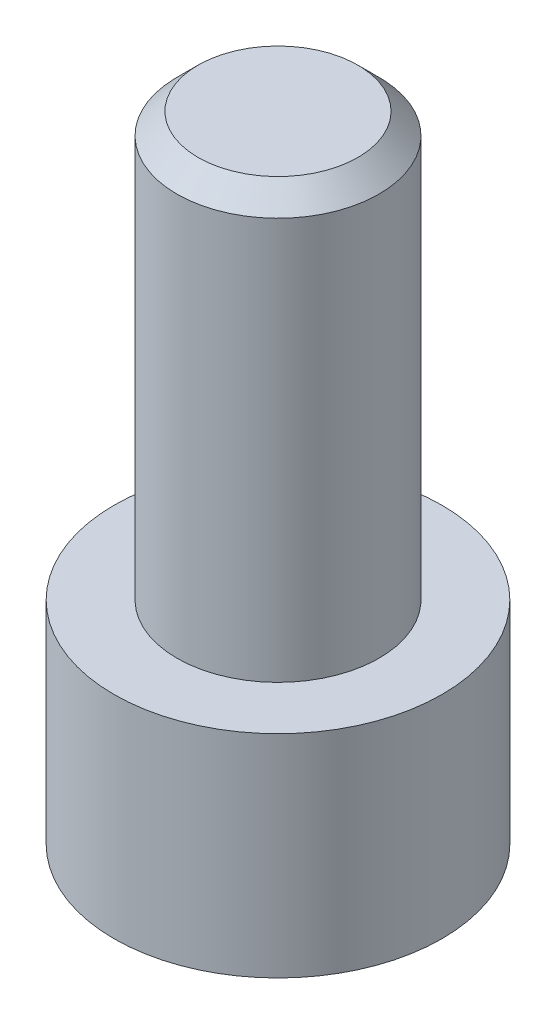
ISO-10303-21;
HEADER;
FILE_DESCRIPTION(('STEP AP214'),'2;1');
FILE_NAME('part.step','',(''),(''),'','','');
FILE_SCHEMA(('AUTOMOTIVE_DESIGN { 1 0 10303 214 1 1 1 1 }'));
ENDSEC;
DATA;
#1=APPLICATION_CONTEXT('core data for automotive mechanical design processes');
#2=APPLICATION_PROTOCOL_DEFINITION('international standard','automotive_design',2000,#1);
#3=PRODUCT_CONTEXT('',#1,'mechanical');
#4=PRODUCT('Part','Part','',(#3));
#5=PRODUCT_RELATED_PRODUCT_CATEGORY('part','',(#4));
#6=PRODUCT_DEFINITION_FORMATION('','',#4);
#7=PRODUCT_DEFINITION_CONTEXT('part definition',#1,'design');
#8=PRODUCT_DEFINITION('design','',#6,#7);
#9=PRODUCT_DEFINITION_SHAPE('','',#8);
#10=(LENGTH_UNIT() NAMED_UNIT(*) SI_UNIT(.MILLI.,.METRE.));
#11=(NAMED_UNIT(*) PLANE_ANGLE_UNIT() SI_UNIT($,.RADIAN.));
#12=(NAMED_UNIT(*) SI_UNIT($,.STERADIAN.) SOLID_ANGLE_UNIT());
#13=UNCERTAINTY_MEASURE_WITH_UNIT(LENGTH_MEASURE(1.E-05),#10,'distance_accuracy_value','');
#14=(GEOMETRIC_REPRESENTATION_CONTEXT(3) GLOBAL_UNCERTAINTY_ASSIGNED_CONTEXT((#13)) GLOBAL_UNIT_ASSIGNED_CONTEXT((#10,
#11,#12)) REPRESENTATION_CONTEXT('',''));
#15=CARTESIAN_POINT('',(0.,0.,0.));
#16=DIRECTION('',(0.,0.,1.));
#17=DIRECTION('',(1.,0.,0.));
#18=AXIS2_PLACEMENT_3D('',#15,#16,#17);
#19=CARTESIAN_POINT('',(0.,15.,0.));
#20=DIRECTION('',(0.,-1.,0.));
#21=DIRECTION('',(0.,0.,-1.));
#22=AXIS2_PLACEMENT_3D('',#19,#20,#21);
#23=CYLINDRICAL_SURFACE('',#22,3.875);
#24=CARTESIAN_POINT('',(0.,0.,0.));
#25=DIRECTION('',(0.,1.,0.));
#26=DIRECTION('',(0.,0.,1.));
#27=AXIS2_PLACEMENT_3D('',#24,#25,#26);
#28=CIRCLE('',#27,3.875);
#29=CARTESIAN_POINT('',(0.,0.,3.875));
#30=VERTEX_POINT('',#29);
#31=EDGE_CURVE('E145',#30,#30,#28,.T.);
#32=ORIENTED_EDGE('',*,*,#31,.T.);
#33=EDGE_LOOP('',(#32));
#34=FACE_BOUND('',#33,.T.);
#35=CARTESIAN_POINT('',(0.,5.,0.));
#36=DIRECTION('',(0.,1.,0.));
#37=DIRECTION('',(0.,0.,1.));
#38=AXIS2_PLACEMENT_3D('',#35,#36,#37);
#39=CIRCLE('',#38,3.875);
#40=CARTESIAN_POINT('',(0.,5.,3.875));
#41=VERTEX_POINT('',#40);
#42=EDGE_CURVE('E144',#41,#41,#39,.T.);
#43=ORIENTED_EDGE('',*,*,#42,.F.);
#44=EDGE_LOOP('',(#43));
#45=FACE_BOUND('',#44,.T.);
#46=ADVANCED_FACE('F34',(#34,#45),#23,.T.);
#47=CARTESIAN_POINT('',(0.,0.,0.));
#48=DIRECTION('',(0.,1.,0.));
#49=DIRECTION('',(0.,0.,1.));
#50=AXIS2_PLACEMENT_3D('',#47,#48,#49);
#51=PLANE('',#50);
#52=DIRECTION('',(-0.5,0.,0.866025403784439));
#53=VECTOR('',#52,1.);
#54=CARTESIAN_POINT('',(2.64426423288849,0.,0.));
#55=LINE('',#54,#53);
#56=CARTESIAN_POINT('',(2.64426423288849,0.,0.));
#57=VERTEX_POINT('',#56);
#58=CARTESIAN_POINT('',(1.32213211644424,0.,2.29));
#59=VERTEX_POINT('',#58);
#60=EDGE_CURVE('E123',#57,#59,#55,.T.);
#61=ORIENTED_EDGE('',*,*,#60,.F.);
#62=DIRECTION('',(0.5,0.,0.866025403784439));
#63=VECTOR('',#62,1.);
#64=CARTESIAN_POINT('',(1.32213211644424,0.,-2.29));
#65=LINE('',#64,#63);
#66=CARTESIAN_POINT('',(1.32213211644424,0.,-2.29));
#67=VERTEX_POINT('',#66);
#68=EDGE_CURVE('E49',#67,#57,#65,.T.);
#69=ORIENTED_EDGE('',*,*,#68,.F.);
#70=DIRECTION('',(1.,0.,0.));
#71=VECTOR('',#70,1.);
#72=CARTESIAN_POINT('',(-1.32213211644424,0.,-2.29));
#73=LINE('',#72,#71);
#74=CARTESIAN_POINT('',(-1.32213211644424,0.,-2.29));
#75=VERTEX_POINT('',#74);
#76=EDGE_CURVE('E132',#75,#67,#73,.T.);
#77=ORIENTED_EDGE('',*,*,#76,.F.);
#78=DIRECTION('',(0.5,0.,-0.866025403784439));
#79=VECTOR('',#78,1.);
#80=CARTESIAN_POINT('',(-2.64426423288849,0.,0.));
#81=LINE('',#80,#79);
#82=CARTESIAN_POINT('',(-2.64426423288849,0.,0.));
#83=VERTEX_POINT('',#82);
#84=EDGE_CURVE('E130',#83,#75,#81,.T.);
#85=ORIENTED_EDGE('',*,*,#84,.F.);
#86=DIRECTION('',(-0.5,0.,-0.866025403784439));
#87=VECTOR('',#86,1.);
#88=CARTESIAN_POINT('',(-1.32213211644424,0.,2.29));
#89=LINE('',#88,#87);
#90=CARTESIAN_POINT('',(-1.32213211644424,0.,2.29));
#91=VERTEX_POINT('',#90);
#92=EDGE_CURVE('E97',#91,#83,#89,.T.);
#93=ORIENTED_EDGE('',*,*,#92,.F.);
#94=DIRECTION('',(-1.,0.,0.));
#95=VECTOR('',#94,1.);
#96=CARTESIAN_POINT('',(1.32213211644424,0.,2.29));
#97=LINE('',#96,#95);
#98=EDGE_CURVE('E126',#59,#91,#97,.T.);
#99=ORIENTED_EDGE('',*,*,#98,.F.);
#100=EDGE_LOOP('',(#61,#69,#77,#85,#93,#99));
#101=FACE_BOUND('',#100,.T.);
#102=ORIENTED_EDGE('',*,*,#31,.F.);
#103=EDGE_LOOP('',(#102));
#104=FACE_BOUND('',#103,.T.);
#105=ADVANCED_FACE('F167',(#101,#104),#51,.F.);
#106=CARTESIAN_POINT('',(0.,5.,0.));
#107=DIRECTION('',(0.,1.,0.));
#108=DIRECTION('',(0.,0.,1.));
#109=AXIS2_PLACEMENT_3D('',#106,#107,#108);
#110=PLANE('',#109);
#111=CARTESIAN_POINT('',(0.,5.,0.));
#112=DIRECTION('',(0.,1.,0.));
#113=DIRECTION('',(0.,0.,1.));
#114=AXIS2_PLACEMENT_3D('',#111,#112,#113);
#115=CIRCLE('',#114,2.39);
#116=CARTESIAN_POINT('',(0.,5.,2.39));
#117=VERTEX_POINT('',#116);
#118=EDGE_CURVE('E136',#117,#117,#115,.T.);
#119=ORIENTED_EDGE('',*,*,#118,.F.);
#120=EDGE_LOOP('',(#119));
#121=FACE_BOUND('',#120,.T.);
#122=ORIENTED_EDGE('',*,*,#42,.T.);
#123=EDGE_LOOP('',(#122));
#124=FACE_BOUND('',#123,.T.);
#125=ADVANCED_FACE('F172',(#121,#124),#110,.T.);
#126=CARTESIAN_POINT('',(0.,5.,0.));
#127=DIRECTION('',(0.,1.,0.));
#128=DIRECTION('',(0.,0.,1.));
#129=AXIS2_PLACEMENT_3D('',#126,#127,#128);
#130=CYLINDRICAL_SURFACE('',#129,2.39);
#131=CARTESIAN_POINT('',(0.,14.5,0.));
#132=DIRECTION('',(0.,1.,0.));
#133=DIRECTION('',(0.,0.,1.));
#134=AXIS2_PLACEMENT_3D('',#131,#132,#133);
#135=CIRCLE('',#134,2.39);
#136=CARTESIAN_POINT('',(0.,14.5,2.39));
#137=VERTEX_POINT('',#136);
#138=EDGE_CURVE('E12',#137,#137,#135,.F.);
#139=ORIENTED_EDGE('',*,*,#138,.T.);
#140=EDGE_LOOP('',(#139));
#141=FACE_BOUND('',#140,.T.);
#142=ORIENTED_EDGE('',*,*,#118,.T.);
#143=EDGE_LOOP('',(#142));
#144=FACE_BOUND('',#143,.T.);
#145=ADVANCED_FACE('F163',(#141,#144),#130,.T.);
#146=CARTESIAN_POINT('',(0.,15.,0.));
#147=DIRECTION('',(0.,1.,0.));
#148=DIRECTION('',(0.,0.,1.));
#149=AXIS2_PLACEMENT_3D('',#146,#147,#148);
#150=PLANE('',#149);
#151=CARTESIAN_POINT('',(0.,15.,0.));
#152=DIRECTION('',(0.,1.,0.));
#153=DIRECTION('',(0.,0.,1.));
#154=AXIS2_PLACEMENT_3D('',#151,#152,#153);
#155=CIRCLE('',#154,1.89);
#156=CARTESIAN_POINT('',(0.,15.,1.89));
#157=VERTEX_POINT('',#156);
#158=EDGE_CURVE('E42',#157,#157,#155,.T.);
#159=ORIENTED_EDGE('',*,*,#158,.T.);
#160=EDGE_LOOP('',(#159));
#161=FACE_BOUND('',#160,.T.);
#162=ADVANCED_FACE('F152',(#161),#150,.T.);
#163=CARTESIAN_POINT('',(0.,15.,0.));
#164=DIRECTION('',(0.,-1.,0.));
#165=DIRECTION('',(0.,0.,-1.));
#166=AXIS2_PLACEMENT_3D('',#163,#164,#165);
#167=CONICAL_SURFACE('',#166,1.89,0.785398163397447);
#168=ORIENTED_EDGE('',*,*,#138,.F.);
#169=EDGE_LOOP('',(#168));
#170=FACE_BOUND('',#169,.T.);
#171=ORIENTED_EDGE('',*,*,#158,.F.);
#172=EDGE_LOOP('',(#171));
#173=FACE_BOUND('',#172,.T.);
#174=ADVANCED_FACE('F36',(#170,#173),#167,.T.);
#175=CARTESIAN_POINT('',(1.32213211644424,3.36,-2.29));
#176=DIRECTION('',(0.866025403784439,0.,-0.5));
#177=DIRECTION('',(-0.5,0.,-0.866025403784439));
#178=AXIS2_PLACEMENT_3D('',#175,#176,#177);
#179=PLANE('',#178);
#180=ORIENTED_EDGE('',*,*,#68,.T.);
#181=DIRECTION('',(0.,-1.,0.));
#182=VECTOR('',#181,1.);
#183=CARTESIAN_POINT('',(2.64426423288849,3.36,0.));
#184=LINE('',#183,#182);
#185=CARTESIAN_POINT('',(2.64426423288849,3.36,0.));
#186=VERTEX_POINT('',#185);
#187=EDGE_CURVE('E79',#186,#57,#184,.T.);
#188=ORIENTED_EDGE('',*,*,#187,.F.);
#189=DIRECTION('',(0.5,0.,0.866025403784439));
#190=VECTOR('',#189,1.);
#191=CARTESIAN_POINT('',(1.32213211644424,3.36,-2.29));
#192=LINE('',#191,#190);
#193=CARTESIAN_POINT('',(1.32213211644424,3.36,-2.29));
#194=VERTEX_POINT('',#193);
#195=EDGE_CURVE('E134',#194,#186,#192,.T.);
#196=ORIENTED_EDGE('',*,*,#195,.F.);
#197=DIRECTION('',(0.,-1.,0.));
#198=VECTOR('',#197,1.);
#199=CARTESIAN_POINT('',(1.32213211644424,3.36,-2.29));
#200=LINE('',#199,#198);
#201=EDGE_CURVE('E57',#194,#67,#200,.T.);
#202=ORIENTED_EDGE('',*,*,#201,.T.);
#203=EDGE_LOOP('',(#180,#188,#196,#202));
#204=FACE_BOUND('',#203,.T.);
#205=ADVANCED_FACE('F155',(#204),#179,.F.);
#206=CARTESIAN_POINT('',(-1.32213211644424,3.36,-2.29));
#207=DIRECTION('',(0.,0.,-1.));
#208=DIRECTION('',(-1.,0.,0.));
#209=AXIS2_PLACEMENT_3D('',#206,#207,#208);
#210=PLANE('',#209);
#211=ORIENTED_EDGE('',*,*,#76,.T.);
#212=ORIENTED_EDGE('',*,*,#201,.F.);
#213=DIRECTION('',(1.,0.,0.));
#214=VECTOR('',#213,1.);
#215=CARTESIAN_POINT('',(-1.32213211644424,3.36,-2.29));
#216=LINE('',#215,#214);
#217=CARTESIAN_POINT('',(-1.32213211644424,3.36,-2.29));
#218=VERTEX_POINT('',#217);
#219=EDGE_CURVE('E109',#218,#194,#216,.T.);
#220=ORIENTED_EDGE('',*,*,#219,.F.);
#221=DIRECTION('',(0.,-1.,0.));
#222=VECTOR('',#221,1.);
#223=CARTESIAN_POINT('',(-1.32213211644424,3.36,-2.29));
#224=LINE('',#223,#222);
#225=EDGE_CURVE('E101',#218,#75,#224,.T.);
#226=ORIENTED_EDGE('',*,*,#225,.T.);
#227=EDGE_LOOP('',(#211,#212,#220,#226));
#228=FACE_BOUND('',#227,.T.);
#229=ADVANCED_FACE('F161',(#228),#210,.F.);
#230=CARTESIAN_POINT('',(-2.64426423288849,3.36,0.));
#231=DIRECTION('',(-0.866025403784438,0.,-0.5));
#232=DIRECTION('',(-0.5,0.,0.866025403784439));
#233=AXIS2_PLACEMENT_3D('',#230,#231,#232);
#234=PLANE('',#233);
#235=ORIENTED_EDGE('',*,*,#84,.T.);
#236=ORIENTED_EDGE('',*,*,#225,.F.);
#237=DIRECTION('',(0.5,0.,-0.866025403784439));
#238=VECTOR('',#237,1.);
#239=CARTESIAN_POINT('',(-2.64426423288849,3.36,0.));
#240=LINE('',#239,#238);
#241=CARTESIAN_POINT('',(-2.64426423288849,3.36,0.));
#242=VERTEX_POINT('',#241);
#243=EDGE_CURVE('E105',#242,#218,#240,.T.);
#244=ORIENTED_EDGE('',*,*,#243,.F.);
#245=DIRECTION('',(0.,-1.,0.));
#246=VECTOR('',#245,1.);
#247=CARTESIAN_POINT('',(-2.64426423288849,3.36,0.));
#248=LINE('',#247,#246);
#249=EDGE_CURVE('E90',#242,#83,#248,.T.);
#250=ORIENTED_EDGE('',*,*,#249,.T.);
#251=EDGE_LOOP('',(#235,#236,#244,#250));
#252=FACE_BOUND('',#251,.T.);
#253=ADVANCED_FACE('F106',(#252),#234,.F.);
#254=CARTESIAN_POINT('',(-1.32213211644424,3.36,2.29));
#255=DIRECTION('',(-0.866025403784439,0.,0.5));
#256=DIRECTION('',(0.5,0.,0.866025403784439));
#257=AXIS2_PLACEMENT_3D('',#254,#255,#256);
#258=PLANE('',#257);
#259=ORIENTED_EDGE('',*,*,#92,.T.);
#260=ORIENTED_EDGE('',*,*,#249,.F.);
#261=DIRECTION('',(-0.5,0.,-0.866025403784439));
#262=VECTOR('',#261,1.);
#263=CARTESIAN_POINT('',(-1.32213211644424,3.36,2.29));
#264=LINE('',#263,#262);
#265=CARTESIAN_POINT('',(-1.32213211644424,3.36,2.29));
#266=VERTEX_POINT('',#265);
#267=EDGE_CURVE('E94',#266,#242,#264,.T.);
#268=ORIENTED_EDGE('',*,*,#267,.F.);
#269=DIRECTION('',(0.,-1.,0.));
#270=VECTOR('',#269,1.);
#271=CARTESIAN_POINT('',(-1.32213211644424,3.36,2.29));
#272=LINE('',#271,#270);
#273=EDGE_CURVE('E102',#266,#91,#272,.T.);
#274=ORIENTED_EDGE('',*,*,#273,.T.);
#275=EDGE_LOOP('',(#259,#260,#268,#274));
#276=FACE_BOUND('',#275,.T.);
#277=ADVANCED_FACE('F92',(#276),#258,.F.);
#278=CARTESIAN_POINT('',(1.32213211644424,3.36,2.29));
#279=DIRECTION('',(0.,0.,1.));
#280=DIRECTION('',(1.,0.,0.));
#281=AXIS2_PLACEMENT_3D('',#278,#279,#280);
#282=PLANE('',#281);
#283=ORIENTED_EDGE('',*,*,#98,.T.);
#284=ORIENTED_EDGE('',*,*,#273,.F.);
#285=DIRECTION('',(-1.,0.,0.));
#286=VECTOR('',#285,1.);
#287=CARTESIAN_POINT('',(1.32213211644424,3.36,2.29));
#288=LINE('',#287,#286);
#289=CARTESIAN_POINT('',(1.32213211644424,3.36,2.29));
#290=VERTEX_POINT('',#289);
#291=EDGE_CURVE('E115',#290,#266,#288,.T.);
#292=ORIENTED_EDGE('',*,*,#291,.F.);
#293=DIRECTION('',(0.,-1.,0.));
#294=VECTOR('',#293,1.);
#295=CARTESIAN_POINT('',(1.32213211644424,3.36,2.29));
#296=LINE('',#295,#294);
#297=EDGE_CURVE('E139',#290,#59,#296,.T.);
#298=ORIENTED_EDGE('',*,*,#297,.T.);
#299=EDGE_LOOP('',(#283,#284,#292,#298));
#300=FACE_BOUND('',#299,.T.);
#301=ADVANCED_FACE('F186',(#300),#282,.F.);
#302=CARTESIAN_POINT('',(2.64426423288849,3.36,0.));
#303=DIRECTION('',(0.866025403784439,0.,0.5));
#304=DIRECTION('',(0.5,0.,-0.866025403784439));
#305=AXIS2_PLACEMENT_3D('',#302,#303,#304);
#306=PLANE('',#305);
#307=ORIENTED_EDGE('',*,*,#60,.T.);
#308=ORIENTED_EDGE('',*,*,#297,.F.);
#309=DIRECTION('',(-0.5,0.,0.866025403784439));
#310=VECTOR('',#309,1.);
#311=CARTESIAN_POINT('',(2.64426423288849,3.36,0.));
#312=LINE('',#311,#310);
#313=EDGE_CURVE('E117',#186,#290,#312,.T.);
#314=ORIENTED_EDGE('',*,*,#313,.F.);
#315=ORIENTED_EDGE('',*,*,#187,.T.);
#316=EDGE_LOOP('',(#307,#308,#314,#315));
#317=FACE_BOUND('',#316,.T.);
#318=ADVANCED_FACE('F183',(#317),#306,.F.);
#319=CARTESIAN_POINT('',(0.,3.36,0.));
#320=DIRECTION('',(0.,-1.,0.));
#321=DIRECTION('',(0.,0.,-1.));
#322=AXIS2_PLACEMENT_3D('',#319,#320,#321);
#323=PLANE('',#322);
#324=ORIENTED_EDGE('',*,*,#195,.T.);
#325=ORIENTED_EDGE('',*,*,#313,.T.);
#326=ORIENTED_EDGE('',*,*,#291,.T.);
#327=ORIENTED_EDGE('',*,*,#267,.T.);
#328=ORIENTED_EDGE('',*,*,#243,.T.);
#329=ORIENTED_EDGE('',*,*,#219,.T.);
#330=EDGE_LOOP('',(#324,#325,#326,#327,#328,#329));
#331=FACE_BOUND('',#330,.T.);
#332=ADVANCED_FACE('F112',(#331),#323,.T.);
#333=CLOSED_SHELL('',(#46,#105,#125,#145,#162,#174,#205,#229,#253,#277,#301,#318,#332));
#334=MANIFOLD_SOLID_BREP('B2',#333);
#335=ADVANCED_BREP_SHAPE_REPRESENTATION('',(#18,#334),#14);
#336=SHAPE_DEFINITION_REPRESENTATION(#9,#335);
ENDSEC;
END-ISO-10303-21;
